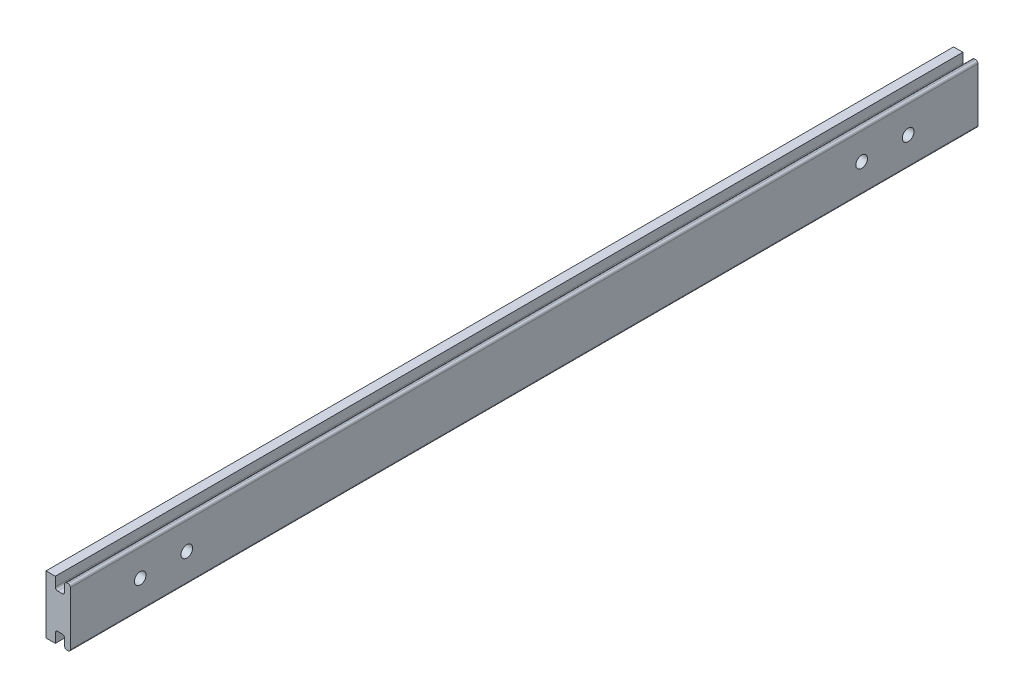
ISO-10303-21;
HEADER;
FILE_DESCRIPTION(('STEP AP214'),'2;1');
FILE_NAME('part.step','',(''),(''),'','','');
FILE_SCHEMA(('AUTOMOTIVE_DESIGN { 1 0 10303 214 1 1 1 1 }'));
ENDSEC;
DATA;
#1=APPLICATION_CONTEXT('core data for automotive mechanical design processes');
#2=APPLICATION_PROTOCOL_DEFINITION('international standard','automotive_design',2000,#1);
#3=PRODUCT_CONTEXT('',#1,'mechanical');
#4=PRODUCT('Part','Part','',(#3));
#5=PRODUCT_RELATED_PRODUCT_CATEGORY('part','',(#4));
#6=PRODUCT_DEFINITION_FORMATION('','',#4);
#7=PRODUCT_DEFINITION_CONTEXT('part definition',#1,'design');
#8=PRODUCT_DEFINITION('design','',#6,#7);
#9=PRODUCT_DEFINITION_SHAPE('','',#8);
#10=(LENGTH_UNIT() NAMED_UNIT(*) SI_UNIT(.MILLI.,.METRE.));
#11=(NAMED_UNIT(*) PLANE_ANGLE_UNIT() SI_UNIT($,.RADIAN.));
#12=(NAMED_UNIT(*) SI_UNIT($,.STERADIAN.) SOLID_ANGLE_UNIT());
#13=UNCERTAINTY_MEASURE_WITH_UNIT(LENGTH_MEASURE(1.E-05),#10,'distance_accuracy_value','');
#14=(GEOMETRIC_REPRESENTATION_CONTEXT(3) GLOBAL_UNCERTAINTY_ASSIGNED_CONTEXT((#13)) GLOBAL_UNIT_ASSIGNED_CONTEXT((#10,
#11,#12)) REPRESENTATION_CONTEXT('',''));
#15=CARTESIAN_POINT('',(0.,0.,0.));
#16=DIRECTION('',(0.,0.,1.));
#17=DIRECTION('',(1.,0.,0.));
#18=AXIS2_PLACEMENT_3D('',#15,#16,#17);
#19=CARTESIAN_POINT('',(1.,-8.5,195.));
#20=DIRECTION('',(0.,0.,-1.));
#21=DIRECTION('',(-1.,0.,0.));
#22=AXIS2_PLACEMENT_3D('',#19,#20,#21);
#23=CYLINDRICAL_SURFACE('',#22,0.999999999999999);
#24=CARTESIAN_POINT('',(1.,-8.5,-195.));
#25=DIRECTION('',(0.,0.,-1.));
#26=DIRECTION('',(-1.,0.,0.));
#27=AXIS2_PLACEMENT_3D('',#24,#25,#26);
#28=CIRCLE('',#27,0.999999999999999);
#29=CARTESIAN_POINT('',(1.,-7.5,-195.));
#30=VERTEX_POINT('',#29);
#31=CARTESIAN_POINT('',(2.,-8.5,-195.));
#32=VERTEX_POINT('',#31);
#33=EDGE_CURVE('E197',#30,#32,#28,.T.);
#34=ORIENTED_EDGE('',*,*,#33,.T.);
#35=DIRECTION('',(0.,0.,-1.));
#36=VECTOR('',#35,1.);
#37=CARTESIAN_POINT('',(2.,-8.5,195.));
#38=LINE('',#37,#36);
#39=CARTESIAN_POINT('',(2.,-8.5,195.));
#40=VERTEX_POINT('',#39);
#41=EDGE_CURVE('E179',#40,#32,#38,.T.);
#42=ORIENTED_EDGE('',*,*,#41,.F.);
#43=CARTESIAN_POINT('',(1.,-8.5,195.));
#44=DIRECTION('',(0.,0.,-1.));
#45=DIRECTION('',(-1.,0.,0.));
#46=AXIS2_PLACEMENT_3D('',#43,#44,#45);
#47=CIRCLE('',#46,0.999999999999999);
#48=CARTESIAN_POINT('',(1.,-7.5,195.));
#49=VERTEX_POINT('',#48);
#50=EDGE_CURVE('E184',#49,#40,#47,.T.);
#51=ORIENTED_EDGE('',*,*,#50,.F.);
#52=DIRECTION('',(0.,0.,-1.));
#53=VECTOR('',#52,1.);
#54=CARTESIAN_POINT('',(1.,-7.5,195.));
#55=LINE('',#54,#53);
#56=EDGE_CURVE('E274',#49,#30,#55,.T.);
#57=ORIENTED_EDGE('',*,*,#56,.T.);
#58=EDGE_LOOP('',(#34,#42,#51,#57));
#59=FACE_BOUND('',#58,.T.);
#60=ADVANCED_FACE('F34',(#59),#23,.F.);
#61=CARTESIAN_POINT('',(2.,-8.5,195.));
#62=DIRECTION('',(1.,0.,0.));
#63=DIRECTION('',(0.,1.,0.));
#64=AXIS2_PLACEMENT_3D('',#61,#62,#63);
#65=PLANE('',#64);
#66=DIRECTION('',(0.,-1.,0.));
#67=VECTOR('',#66,1.);
#68=CARTESIAN_POINT('',(2.,-8.5,-195.));
#69=LINE('',#68,#67);
#70=CARTESIAN_POINT('',(2.,-11.5,-195.));
#71=VERTEX_POINT('',#70);
#72=EDGE_CURVE('E243',#32,#71,#69,.T.);
#73=ORIENTED_EDGE('',*,*,#72,.T.);
#74=DIRECTION('',(0.,0.,-1.));
#75=VECTOR('',#74,1.);
#76=CARTESIAN_POINT('',(2.,-11.5,195.));
#77=LINE('',#76,#75);
#78=CARTESIAN_POINT('',(2.,-11.5,195.));
#79=VERTEX_POINT('',#78);
#80=EDGE_CURVE('E42',#71,#79,#77,.F.);
#81=ORIENTED_EDGE('',*,*,#80,.T.);
#82=DIRECTION('',(0.,-1.,0.));
#83=VECTOR('',#82,1.);
#84=CARTESIAN_POINT('',(2.,-8.5,195.));
#85=LINE('',#84,#83);
#86=EDGE_CURVE('E174',#40,#79,#85,.T.);
#87=ORIENTED_EDGE('',*,*,#86,.F.);
#88=ORIENTED_EDGE('',*,*,#41,.T.);
#89=EDGE_LOOP('',(#73,#81,#87,#88));
#90=FACE_BOUND('',#89,.T.);
#91=ADVANCED_FACE('F177',(#90),#65,.F.);
#92=CARTESIAN_POINT('',(2.,-12.5,195.));
#93=DIRECTION('',(0.,1.,0.));
#94=DIRECTION('',(0.,0.,1.));
#95=AXIS2_PLACEMENT_3D('',#92,#93,#94);
#96=PLANE('',#95);
#97=DIRECTION('',(1.,0.,0.));
#98=VECTOR('',#97,1.);
#99=CARTESIAN_POINT('',(2.,-12.5,-195.));
#100=LINE('',#99,#98);
#101=CARTESIAN_POINT('',(3.,-12.5,-195.));
#102=VERTEX_POINT('',#101);
#103=CARTESIAN_POINT('',(3.5,-12.5,-195.));
#104=VERTEX_POINT('',#103);
#105=EDGE_CURVE('E236',#102,#104,#100,.T.);
#106=ORIENTED_EDGE('',*,*,#105,.T.);
#107=DIRECTION('',(0.,0.,-1.));
#108=VECTOR('',#107,1.);
#109=CARTESIAN_POINT('',(3.5,-12.5,195.));
#110=LINE('',#109,#108);
#111=CARTESIAN_POINT('',(3.5,-12.5,195.));
#112=VERTEX_POINT('',#111);
#113=EDGE_CURVE('E57',#104,#112,#110,.F.);
#114=ORIENTED_EDGE('',*,*,#113,.T.);
#115=DIRECTION('',(1.,0.,0.));
#116=VECTOR('',#115,1.);
#117=CARTESIAN_POINT('',(2.,-12.5,195.));
#118=LINE('',#117,#116);
#119=CARTESIAN_POINT('',(3.,-12.5,195.));
#120=VERTEX_POINT('',#119);
#121=EDGE_CURVE('E183',#120,#112,#118,.T.);
#122=ORIENTED_EDGE('',*,*,#121,.F.);
#123=DIRECTION('',(0.,0.,-1.));
#124=VECTOR('',#123,1.);
#125=CARTESIAN_POINT('',(3.,-12.5,195.));
#126=LINE('',#125,#124);
#127=EDGE_CURVE('E230',#120,#102,#126,.T.);
#128=ORIENTED_EDGE('',*,*,#127,.T.);
#129=EDGE_LOOP('',(#106,#114,#122,#128));
#130=FACE_BOUND('',#129,.T.);
#131=ADVANCED_FACE('F235',(#130),#96,.F.);
#132=CARTESIAN_POINT('',(4.5,-12.5,195.));
#133=DIRECTION('',(-1.,0.,0.));
#134=DIRECTION('',(0.,0.,1.));
#135=AXIS2_PLACEMENT_3D('',#132,#133,#134);
#136=PLANE('',#135);
#137=CARTESIAN_POINT('',(4.5,0.,-145.));
#138=DIRECTION('',(-1.,0.,0.));
#139=DIRECTION('',(0.,0.,1.));
#140=AXIS2_PLACEMENT_3D('',#137,#138,#139);
#141=CIRCLE('',#140,2.5);
#142=CARTESIAN_POINT('',(4.5,0.,-142.5));
#143=VERTEX_POINT('',#142);
#144=EDGE_CURVE('E346',#143,#143,#141,.F.);
#145=ORIENTED_EDGE('',*,*,#144,.F.);
#146=EDGE_LOOP('',(#145));
#147=FACE_BOUND('',#146,.T.);
#148=CARTESIAN_POINT('',(4.5,0.,165.));
#149=DIRECTION('',(-1.,0.,0.));
#150=DIRECTION('',(0.,0.,1.));
#151=AXIS2_PLACEMENT_3D('',#148,#149,#150);
#152=CIRCLE('',#151,2.5);
#153=CARTESIAN_POINT('',(4.5,0.,167.5));
#154=VERTEX_POINT('',#153);
#155=EDGE_CURVE('E470',#154,#154,#152,.F.);
#156=ORIENTED_EDGE('',*,*,#155,.F.);
#157=EDGE_LOOP('',(#156));
#158=FACE_BOUND('',#157,.T.);
#159=CARTESIAN_POINT('',(4.5,0.,145.));
#160=DIRECTION('',(-1.,0.,0.));
#161=DIRECTION('',(0.,0.,1.));
#162=AXIS2_PLACEMENT_3D('',#159,#160,#161);
#163=CIRCLE('',#162,2.5);
#164=CARTESIAN_POINT('',(4.5,0.,147.5));
#165=VERTEX_POINT('',#164);
#166=EDGE_CURVE('E476',#165,#165,#163,.F.);
#167=ORIENTED_EDGE('',*,*,#166,.F.);
#168=EDGE_LOOP('',(#167));
#169=FACE_BOUND('',#168,.T.);
#170=CARTESIAN_POINT('',(4.5,0.,-165.));
#171=DIRECTION('',(-1.,0.,0.));
#172=DIRECTION('',(0.,0.,1.));
#173=AXIS2_PLACEMENT_3D('',#170,#171,#172);
#174=CIRCLE('',#173,2.5);
#175=CARTESIAN_POINT('',(4.5,0.,-162.5));
#176=VERTEX_POINT('',#175);
#177=EDGE_CURVE('E339',#176,#176,#174,.F.);
#178=ORIENTED_EDGE('',*,*,#177,.F.);
#179=EDGE_LOOP('',(#178));
#180=FACE_BOUND('',#179,.T.);
#181=DIRECTION('',(0.,1.,0.));
#182=VECTOR('',#181,1.);
#183=CARTESIAN_POINT('',(4.5,-12.5,-195.));
#184=LINE('',#183,#182);
#185=CARTESIAN_POINT('',(4.5,-11.5,-195.));
#186=VERTEX_POINT('',#185);
#187=CARTESIAN_POINT('',(4.5,11.5,-195.));
#188=VERTEX_POINT('',#187);
#189=EDGE_CURVE('E242',#186,#188,#184,.T.);
#190=ORIENTED_EDGE('',*,*,#189,.T.);
#191=DIRECTION('',(0.,0.,-1.));
#192=VECTOR('',#191,1.);
#193=CARTESIAN_POINT('',(4.5,11.5,195.));
#194=LINE('',#193,#192);
#195=CARTESIAN_POINT('',(4.5,11.5,195.));
#196=VERTEX_POINT('',#195);
#197=EDGE_CURVE('E221',#188,#196,#194,.F.);
#198=ORIENTED_EDGE('',*,*,#197,.T.);
#199=DIRECTION('',(0.,1.,0.));
#200=VECTOR('',#199,1.);
#201=CARTESIAN_POINT('',(4.5,-12.5,195.));
#202=LINE('',#201,#200);
#203=CARTESIAN_POINT('',(4.5,-11.5,195.));
#204=VERTEX_POINT('',#203);
#205=EDGE_CURVE('E351',#204,#196,#202,.T.);
#206=ORIENTED_EDGE('',*,*,#205,.F.);
#207=DIRECTION('',(0.,0.,-1.));
#208=VECTOR('',#207,1.);
#209=CARTESIAN_POINT('',(4.5,-11.5,195.));
#210=LINE('',#209,#208);
#211=EDGE_CURVE('E218',#204,#186,#210,.T.);
#212=ORIENTED_EDGE('',*,*,#211,.T.);
#213=EDGE_LOOP('',(#190,#198,#206,#212));
#214=FACE_BOUND('',#213,.T.);
#215=ADVANCED_FACE('F397',(#147,#158,#169,#180,#214),#136,.F.);
#216=CARTESIAN_POINT('',(2.,12.5,195.));
#217=DIRECTION('',(0.,-1.,0.));
#218=DIRECTION('',(0.,0.,-1.));
#219=AXIS2_PLACEMENT_3D('',#216,#217,#218);
#220=PLANE('',#219);
#221=DIRECTION('',(-1.,0.,0.));
#222=VECTOR('',#221,1.);
#223=CARTESIAN_POINT('',(2.,12.5,195.));
#224=LINE('',#223,#222);
#225=CARTESIAN_POINT('',(3.5,12.5,195.));
#226=VERTEX_POINT('',#225);
#227=CARTESIAN_POINT('',(3.,12.5,195.));
#228=VERTEX_POINT('',#227);
#229=EDGE_CURVE('E353',#226,#228,#224,.T.);
#230=ORIENTED_EDGE('',*,*,#229,.F.);
#231=DIRECTION('',(0.,0.,-1.));
#232=VECTOR('',#231,1.);
#233=CARTESIAN_POINT('',(3.5,12.5,195.));
#234=LINE('',#233,#232);
#235=CARTESIAN_POINT('',(3.5,12.5,-195.));
#236=VERTEX_POINT('',#235);
#237=EDGE_CURVE('E201',#226,#236,#234,.T.);
#238=ORIENTED_EDGE('',*,*,#237,.T.);
#239=DIRECTION('',(-1.,0.,0.));
#240=VECTOR('',#239,1.);
#241=CARTESIAN_POINT('',(2.,12.5,-195.));
#242=LINE('',#241,#240);
#243=CARTESIAN_POINT('',(3.,12.5,-195.));
#244=VERTEX_POINT('',#243);
#245=EDGE_CURVE('E246',#236,#244,#242,.T.);
#246=ORIENTED_EDGE('',*,*,#245,.T.);
#247=DIRECTION('',(0.,0.,-1.));
#248=VECTOR('',#247,1.);
#249=CARTESIAN_POINT('',(3.,12.5,195.));
#250=LINE('',#249,#248);
#251=EDGE_CURVE('E198',#244,#228,#250,.F.);
#252=ORIENTED_EDGE('',*,*,#251,.T.);
#253=EDGE_LOOP('',(#230,#238,#246,#252));
#254=FACE_BOUND('',#253,.T.);
#255=ADVANCED_FACE('F367',(#254),#220,.F.);
#256=CARTESIAN_POINT('',(2.,8.5,195.));
#257=DIRECTION('',(1.,0.,0.));
#258=DIRECTION('',(0.,1.,0.));
#259=AXIS2_PLACEMENT_3D('',#256,#257,#258);
#260=PLANE('',#259);
#261=DIRECTION('',(0.,-1.,0.));
#262=VECTOR('',#261,1.);
#263=CARTESIAN_POINT('',(2.,8.5,195.));
#264=LINE('',#263,#262);
#265=CARTESIAN_POINT('',(2.,11.5,195.));
#266=VERTEX_POINT('',#265);
#267=CARTESIAN_POINT('',(2.,8.5,195.));
#268=VERTEX_POINT('',#267);
#269=EDGE_CURVE('E355',#266,#268,#264,.T.);
#270=ORIENTED_EDGE('',*,*,#269,.F.);
#271=DIRECTION('',(0.,0.,-1.));
#272=VECTOR('',#271,1.);
#273=CARTESIAN_POINT('',(2.,11.5,195.));
#274=LINE('',#273,#272);
#275=CARTESIAN_POINT('',(2.,11.5,-195.));
#276=VERTEX_POINT('',#275);
#277=EDGE_CURVE('E11',#266,#276,#274,.T.);
#278=ORIENTED_EDGE('',*,*,#277,.T.);
#279=DIRECTION('',(0.,-1.,0.));
#280=VECTOR('',#279,1.);
#281=CARTESIAN_POINT('',(2.,8.5,-195.));
#282=LINE('',#281,#280);
#283=CARTESIAN_POINT('',(2.,8.5,-195.));
#284=VERTEX_POINT('',#283);
#285=EDGE_CURVE('E253',#276,#284,#282,.T.);
#286=ORIENTED_EDGE('',*,*,#285,.T.);
#287=DIRECTION('',(0.,0.,-1.));
#288=VECTOR('',#287,1.);
#289=CARTESIAN_POINT('',(2.,8.5,195.));
#290=LINE('',#289,#288);
#291=EDGE_CURVE('E199',#268,#284,#290,.T.);
#292=ORIENTED_EDGE('',*,*,#291,.F.);
#293=EDGE_LOOP('',(#270,#278,#286,#292));
#294=FACE_BOUND('',#293,.T.);
#295=ADVANCED_FACE('F361',(#294),#260,.F.);
#296=CARTESIAN_POINT('',(1.,8.5,195.));
#297=DIRECTION('',(0.,0.,-1.));
#298=DIRECTION('',(-1.,0.,0.));
#299=AXIS2_PLACEMENT_3D('',#296,#297,#298);
#300=CYLINDRICAL_SURFACE('',#299,0.999999999999999);
#301=CARTESIAN_POINT('',(1.,8.5,-195.));
#302=DIRECTION('',(0.,0.,-1.));
#303=DIRECTION('',(-1.,0.,0.));
#304=AXIS2_PLACEMENT_3D('',#301,#302,#303);
#305=CIRCLE('',#304,0.999999999999999);
#306=CARTESIAN_POINT('',(1.,7.5,-195.));
#307=VERTEX_POINT('',#306);
#308=EDGE_CURVE('E255',#284,#307,#305,.T.);
#309=ORIENTED_EDGE('',*,*,#308,.T.);
#310=DIRECTION('',(0.,0.,-1.));
#311=VECTOR('',#310,1.);
#312=CARTESIAN_POINT('',(1.,7.5,195.));
#313=LINE('',#312,#311);
#314=CARTESIAN_POINT('',(1.,7.5,195.));
#315=VERTEX_POINT('',#314);
#316=EDGE_CURVE('E204',#315,#307,#313,.T.);
#317=ORIENTED_EDGE('',*,*,#316,.F.);
#318=CARTESIAN_POINT('',(1.,8.5,195.));
#319=DIRECTION('',(0.,0.,-1.));
#320=DIRECTION('',(-1.,0.,0.));
#321=AXIS2_PLACEMENT_3D('',#318,#319,#320);
#322=CIRCLE('',#321,0.999999999999999);
#323=EDGE_CURVE('E357',#268,#315,#322,.T.);
#324=ORIENTED_EDGE('',*,*,#323,.F.);
#325=ORIENTED_EDGE('',*,*,#291,.T.);
#326=EDGE_LOOP('',(#309,#317,#324,#325));
#327=FACE_BOUND('',#326,.T.);
#328=ADVANCED_FACE('F359',(#327),#300,.F.);
#329=CARTESIAN_POINT('',(-1.,7.5,195.));
#330=DIRECTION('',(0.,-1.,0.));
#331=DIRECTION('',(0.,0.,-1.));
#332=AXIS2_PLACEMENT_3D('',#329,#330,#331);
#333=PLANE('',#332);
#334=DIRECTION('',(-1.,0.,0.));
#335=VECTOR('',#334,1.);
#336=CARTESIAN_POINT('',(-1.,7.5,-195.));
#337=LINE('',#336,#335);
#338=CARTESIAN_POINT('',(-1.,7.5,-195.));
#339=VERTEX_POINT('',#338);
#340=EDGE_CURVE('E257',#307,#339,#337,.T.);
#341=ORIENTED_EDGE('',*,*,#340,.T.);
#342=DIRECTION('',(0.,0.,-1.));
#343=VECTOR('',#342,1.);
#344=CARTESIAN_POINT('',(-1.,7.5,195.));
#345=LINE('',#344,#343);
#346=CARTESIAN_POINT('',(-1.,7.5,195.));
#347=VERTEX_POINT('',#346);
#348=EDGE_CURVE('E297',#347,#339,#345,.T.);
#349=ORIENTED_EDGE('',*,*,#348,.F.);
#350=DIRECTION('',(-1.,0.,0.));
#351=VECTOR('',#350,1.);
#352=CARTESIAN_POINT('',(-1.,7.5,195.));
#353=LINE('',#352,#351);
#354=EDGE_CURVE('E306',#315,#347,#353,.T.);
#355=ORIENTED_EDGE('',*,*,#354,.F.);
#356=ORIENTED_EDGE('',*,*,#316,.T.);
#357=EDGE_LOOP('',(#341,#349,#355,#356));
#358=FACE_BOUND('',#357,.T.);
#359=ADVANCED_FACE('F304',(#358),#333,.F.);
#360=CARTESIAN_POINT('',(-1.,8.5,195.));
#361=DIRECTION('',(0.,0.,-1.));
#362=DIRECTION('',(-1.,0.,0.));
#363=AXIS2_PLACEMENT_3D('',#360,#361,#362);
#364=CYLINDRICAL_SURFACE('',#363,0.999999999999999);
#365=CARTESIAN_POINT('',(-1.,8.5,-195.));
#366=DIRECTION('',(0.,0.,-1.));
#367=DIRECTION('',(-1.,0.,0.));
#368=AXIS2_PLACEMENT_3D('',#365,#366,#367);
#369=CIRCLE('',#368,0.999999999999999);
#370=CARTESIAN_POINT('',(-2.,8.5,-195.));
#371=VERTEX_POINT('',#370);
#372=EDGE_CURVE('E259',#339,#371,#369,.T.);
#373=ORIENTED_EDGE('',*,*,#372,.T.);
#374=DIRECTION('',(0.,0.,-1.));
#375=VECTOR('',#374,1.);
#376=CARTESIAN_POINT('',(-2.,8.5,195.));
#377=LINE('',#376,#375);
#378=CARTESIAN_POINT('',(-2.,8.5,195.));
#379=VERTEX_POINT('',#378);
#380=EDGE_CURVE('E294',#379,#371,#377,.T.);
#381=ORIENTED_EDGE('',*,*,#380,.F.);
#382=CARTESIAN_POINT('',(-1.,8.5,195.));
#383=DIRECTION('',(0.,0.,-1.));
#384=DIRECTION('',(-1.,0.,0.));
#385=AXIS2_PLACEMENT_3D('',#382,#383,#384);
#386=CIRCLE('',#385,0.999999999999999);
#387=EDGE_CURVE('E325',#347,#379,#386,.T.);
#388=ORIENTED_EDGE('',*,*,#387,.F.);
#389=ORIENTED_EDGE('',*,*,#348,.T.);
#390=EDGE_LOOP('',(#373,#381,#388,#389));
#391=FACE_BOUND('',#390,.T.);
#392=ADVANCED_FACE('F316',(#391),#364,.F.);
#393=CARTESIAN_POINT('',(-2.,12.5,195.));
#394=DIRECTION('',(-1.,0.,0.));
#395=DIRECTION('',(0.,-1.,0.));
#396=AXIS2_PLACEMENT_3D('',#393,#394,#395);
#397=PLANE('',#396);
#398=DIRECTION('',(0.,1.,0.));
#399=VECTOR('',#398,1.);
#400=CARTESIAN_POINT('',(-2.,12.5,-195.));
#401=LINE('',#400,#399);
#402=CARTESIAN_POINT('',(-2.,12.5,-195.));
#403=VERTEX_POINT('',#402);
#404=EDGE_CURVE('E261',#371,#403,#401,.T.);
#405=ORIENTED_EDGE('',*,*,#404,.T.);
#406=DIRECTION('',(0.,0.,-1.));
#407=VECTOR('',#406,1.);
#408=CARTESIAN_POINT('',(-2.,12.5,195.));
#409=LINE('',#408,#407);
#410=CARTESIAN_POINT('',(-2.,12.5,195.));
#411=VERTEX_POINT('',#410);
#412=EDGE_CURVE('E291',#411,#403,#409,.T.);
#413=ORIENTED_EDGE('',*,*,#412,.F.);
#414=DIRECTION('',(0.,1.,0.));
#415=VECTOR('',#414,1.);
#416=CARTESIAN_POINT('',(-2.,12.5,195.));
#417=LINE('',#416,#415);
#418=EDGE_CURVE('E322',#379,#411,#417,.T.);
#419=ORIENTED_EDGE('',*,*,#418,.F.);
#420=ORIENTED_EDGE('',*,*,#380,.T.);
#421=EDGE_LOOP('',(#405,#413,#419,#420));
#422=FACE_BOUND('',#421,.T.);
#423=ADVANCED_FACE('F320',(#422),#397,.F.);
#424=CARTESIAN_POINT('',(-6.,12.5,195.));
#425=DIRECTION('',(0.,-1.,0.));
#426=DIRECTION('',(0.,0.,-1.));
#427=AXIS2_PLACEMENT_3D('',#424,#425,#426);
#428=PLANE('',#427);
#429=DIRECTION('',(-1.,0.,0.));
#430=VECTOR('',#429,1.);
#431=CARTESIAN_POINT('',(-6.,12.5,-195.));
#432=LINE('',#431,#430);
#433=CARTESIAN_POINT('',(-6.,12.5,-195.));
#434=VERTEX_POINT('',#433);
#435=EDGE_CURVE('E263',#403,#434,#432,.T.);
#436=ORIENTED_EDGE('',*,*,#435,.T.);
#437=DIRECTION('',(0.,0.,-1.));
#438=VECTOR('',#437,1.);
#439=CARTESIAN_POINT('',(-6.,12.5,195.));
#440=LINE('',#439,#438);
#441=CARTESIAN_POINT('',(-6.,12.5,195.));
#442=VERTEX_POINT('',#441);
#443=EDGE_CURVE('E288',#442,#434,#440,.T.);
#444=ORIENTED_EDGE('',*,*,#443,.F.);
#445=DIRECTION('',(-1.,0.,0.));
#446=VECTOR('',#445,1.);
#447=CARTESIAN_POINT('',(-6.,12.5,195.));
#448=LINE('',#447,#446);
#449=EDGE_CURVE('E324',#411,#442,#448,.T.);
#450=ORIENTED_EDGE('',*,*,#449,.F.);
#451=ORIENTED_EDGE('',*,*,#412,.T.);
#452=EDGE_LOOP('',(#436,#444,#450,#451));
#453=FACE_BOUND('',#452,.T.);
#454=ADVANCED_FACE('F420',(#453),#428,.F.);
#455=CARTESIAN_POINT('',(-6.,12.5,195.));
#456=DIRECTION('',(1.,0.,0.));
#457=DIRECTION('',(0.,0.,-1.));
#458=AXIS2_PLACEMENT_3D('',#455,#456,#457);
#459=PLANE('',#458);
#460=CARTESIAN_POINT('',(-6.,0.,-145.));
#461=DIRECTION('',(-1.,0.,0.));
#462=DIRECTION('',(0.,0.,1.));
#463=AXIS2_PLACEMENT_3D('',#460,#461,#462);
#464=CIRCLE('',#463,2.5);
#465=CARTESIAN_POINT('',(-6.,0.,-142.5));
#466=VERTEX_POINT('',#465);
#467=EDGE_CURVE('E467',#466,#466,#464,.T.);
#468=ORIENTED_EDGE('',*,*,#467,.F.);
#469=EDGE_LOOP('',(#468));
#470=FACE_BOUND('',#469,.T.);
#471=CARTESIAN_POINT('',(-6.,0.,165.));
#472=DIRECTION('',(-1.,0.,0.));
#473=DIRECTION('',(0.,0.,-1.));
#474=AXIS2_PLACEMENT_3D('',#471,#472,#473);
#475=CIRCLE('',#474,2.5);
#476=CARTESIAN_POINT('',(-6.,0.,162.5));
#477=VERTEX_POINT('',#476);
#478=EDGE_CURVE('E473',#477,#477,#475,.T.);
#479=ORIENTED_EDGE('',*,*,#478,.F.);
#480=EDGE_LOOP('',(#479));
#481=FACE_BOUND('',#480,.T.);
#482=CARTESIAN_POINT('',(-6.,0.,145.));
#483=DIRECTION('',(-1.,0.,0.));
#484=DIRECTION('',(0.,0.,-1.));
#485=AXIS2_PLACEMENT_3D('',#482,#483,#484);
#486=CIRCLE('',#485,2.5);
#487=CARTESIAN_POINT('',(-6.,0.,142.5));
#488=VERTEX_POINT('',#487);
#489=EDGE_CURVE('E479',#488,#488,#486,.T.);
#490=ORIENTED_EDGE('',*,*,#489,.F.);
#491=EDGE_LOOP('',(#490));
#492=FACE_BOUND('',#491,.T.);
#493=CARTESIAN_POINT('',(-6.,0.,-165.));
#494=DIRECTION('',(-1.,0.,0.));
#495=DIRECTION('',(0.,0.,1.));
#496=AXIS2_PLACEMENT_3D('',#493,#494,#495);
#497=CIRCLE('',#496,2.5);
#498=CARTESIAN_POINT('',(-6.,0.,-162.5));
#499=VERTEX_POINT('',#498);
#500=EDGE_CURVE('E341',#499,#499,#497,.T.);
#501=ORIENTED_EDGE('',*,*,#500,.F.);
#502=EDGE_LOOP('',(#501));
#503=FACE_BOUND('',#502,.T.);
#504=DIRECTION('',(0.,-1.,0.));
#505=VECTOR('',#504,1.);
#506=CARTESIAN_POINT('',(-6.,12.5,-195.));
#507=LINE('',#506,#505);
#508=CARTESIAN_POINT('',(-6.,-12.5,-195.));
#509=VERTEX_POINT('',#508);
#510=EDGE_CURVE('E265',#434,#509,#507,.T.);
#511=ORIENTED_EDGE('',*,*,#510,.T.);
#512=DIRECTION('',(0.,0.,-1.));
#513=VECTOR('',#512,1.);
#514=CARTESIAN_POINT('',(-6.,-12.5,195.));
#515=LINE('',#514,#513);
#516=CARTESIAN_POINT('',(-6.,-12.5,195.));
#517=VERTEX_POINT('',#516);
#518=EDGE_CURVE('E285',#517,#509,#515,.T.);
#519=ORIENTED_EDGE('',*,*,#518,.F.);
#520=DIRECTION('',(0.,-1.,0.));
#521=VECTOR('',#520,1.);
#522=CARTESIAN_POINT('',(-6.,12.5,195.));
#523=LINE('',#522,#521);
#524=EDGE_CURVE('E327',#442,#517,#523,.T.);
#525=ORIENTED_EDGE('',*,*,#524,.F.);
#526=ORIENTED_EDGE('',*,*,#443,.T.);
#527=EDGE_LOOP('',(#511,#519,#525,#526));
#528=FACE_BOUND('',#527,.T.);
#529=ADVANCED_FACE('F423',(#470,#481,#492,#503,#528),#459,.F.);
#530=CARTESIAN_POINT('',(-6.,-12.5,195.));
#531=DIRECTION('',(0.,1.,0.));
#532=DIRECTION('',(0.,0.,1.));
#533=AXIS2_PLACEMENT_3D('',#530,#531,#532);
#534=PLANE('',#533);
#535=DIRECTION('',(1.,0.,0.));
#536=VECTOR('',#535,1.);
#537=CARTESIAN_POINT('',(-6.,-12.5,-195.));
#538=LINE('',#537,#536);
#539=CARTESIAN_POINT('',(-2.,-12.5,-195.));
#540=VERTEX_POINT('',#539);
#541=EDGE_CURVE('E267',#509,#540,#538,.T.);
#542=ORIENTED_EDGE('',*,*,#541,.T.);
#543=DIRECTION('',(0.,0.,-1.));
#544=VECTOR('',#543,1.);
#545=CARTESIAN_POINT('',(-2.,-12.5,195.));
#546=LINE('',#545,#544);
#547=CARTESIAN_POINT('',(-2.,-12.5,195.));
#548=VERTEX_POINT('',#547);
#549=EDGE_CURVE('E282',#548,#540,#546,.T.);
#550=ORIENTED_EDGE('',*,*,#549,.F.);
#551=DIRECTION('',(1.,0.,0.));
#552=VECTOR('',#551,1.);
#553=CARTESIAN_POINT('',(-6.,-12.5,195.));
#554=LINE('',#553,#552);
#555=EDGE_CURVE('E333',#517,#548,#554,.T.);
#556=ORIENTED_EDGE('',*,*,#555,.F.);
#557=ORIENTED_EDGE('',*,*,#518,.T.);
#558=EDGE_LOOP('',(#542,#550,#556,#557));
#559=FACE_BOUND('',#558,.T.);
#560=ADVANCED_FACE('F427',(#559),#534,.F.);
#561=CARTESIAN_POINT('',(-2.,-12.5,195.));
#562=DIRECTION('',(-1.,0.,0.));
#563=DIRECTION('',(0.,-1.,0.));
#564=AXIS2_PLACEMENT_3D('',#561,#562,#563);
#565=PLANE('',#564);
#566=DIRECTION('',(0.,1.,0.));
#567=VECTOR('',#566,1.);
#568=CARTESIAN_POINT('',(-2.,-12.5,-195.));
#569=LINE('',#568,#567);
#570=CARTESIAN_POINT('',(-2.,-8.5,-195.));
#571=VERTEX_POINT('',#570);
#572=EDGE_CURVE('E269',#540,#571,#569,.T.);
#573=ORIENTED_EDGE('',*,*,#572,.T.);
#574=DIRECTION('',(0.,0.,-1.));
#575=VECTOR('',#574,1.);
#576=CARTESIAN_POINT('',(-2.,-8.5,195.));
#577=LINE('',#576,#575);
#578=CARTESIAN_POINT('',(-2.,-8.5,195.));
#579=VERTEX_POINT('',#578);
#580=EDGE_CURVE('E279',#579,#571,#577,.T.);
#581=ORIENTED_EDGE('',*,*,#580,.F.);
#582=DIRECTION('',(0.,1.,0.));
#583=VECTOR('',#582,1.);
#584=CARTESIAN_POINT('',(-2.,-12.5,195.));
#585=LINE('',#584,#583);
#586=EDGE_CURVE('E335',#548,#579,#585,.T.);
#587=ORIENTED_EDGE('',*,*,#586,.F.);
#588=ORIENTED_EDGE('',*,*,#549,.T.);
#589=EDGE_LOOP('',(#573,#581,#587,#588));
#590=FACE_BOUND('',#589,.T.);
#591=ADVANCED_FACE('F431',(#590),#565,.F.);
#592=CARTESIAN_POINT('',(-1.,-8.5,195.));
#593=DIRECTION('',(0.,0.,-1.));
#594=DIRECTION('',(-1.,0.,0.));
#595=AXIS2_PLACEMENT_3D('',#592,#593,#594);
#596=CYLINDRICAL_SURFACE('',#595,0.999999999999999);
#597=CARTESIAN_POINT('',(-1.,-8.5,-195.));
#598=DIRECTION('',(0.,0.,-1.));
#599=DIRECTION('',(-1.,0.,0.));
#600=AXIS2_PLACEMENT_3D('',#597,#598,#599);
#601=CIRCLE('',#600,0.999999999999999);
#602=CARTESIAN_POINT('',(-1.,-7.5,-195.));
#603=VERTEX_POINT('',#602);
#604=EDGE_CURVE('E271',#571,#603,#601,.T.);
#605=ORIENTED_EDGE('',*,*,#604,.T.);
#606=DIRECTION('',(0.,0.,-1.));
#607=VECTOR('',#606,1.);
#608=CARTESIAN_POINT('',(-1.,-7.5,195.));
#609=LINE('',#608,#607);
#610=CARTESIAN_POINT('',(-1.,-7.5,195.));
#611=VERTEX_POINT('',#610);
#612=EDGE_CURVE('E276',#611,#603,#609,.T.);
#613=ORIENTED_EDGE('',*,*,#612,.F.);
#614=CARTESIAN_POINT('',(-1.,-8.5,195.));
#615=DIRECTION('',(0.,0.,-1.));
#616=DIRECTION('',(-1.,0.,0.));
#617=AXIS2_PLACEMENT_3D('',#614,#615,#616);
#618=CIRCLE('',#617,0.999999999999999);
#619=EDGE_CURVE('E337',#579,#611,#618,.T.);
#620=ORIENTED_EDGE('',*,*,#619,.F.);
#621=ORIENTED_EDGE('',*,*,#580,.T.);
#622=EDGE_LOOP('',(#605,#613,#620,#621));
#623=FACE_BOUND('',#622,.T.);
#624=ADVANCED_FACE('F435',(#623),#596,.F.);
#625=CARTESIAN_POINT('',(-1.,-7.5,195.));
#626=DIRECTION('',(0.,1.,0.));
#627=DIRECTION('',(0.,0.,1.));
#628=AXIS2_PLACEMENT_3D('',#625,#626,#627);
#629=PLANE('',#628);
#630=DIRECTION('',(1.,0.,0.));
#631=VECTOR('',#630,1.);
#632=CARTESIAN_POINT('',(-1.,-7.5,-195.));
#633=LINE('',#632,#631);
#634=EDGE_CURVE('E194',#603,#30,#633,.T.);
#635=ORIENTED_EDGE('',*,*,#634,.T.);
#636=ORIENTED_EDGE('',*,*,#56,.F.);
#637=DIRECTION('',(1.,0.,0.));
#638=VECTOR('',#637,1.);
#639=CARTESIAN_POINT('',(-1.,-7.5,195.));
#640=LINE('',#639,#638);
#641=EDGE_CURVE('E190',#611,#49,#640,.T.);
#642=ORIENTED_EDGE('',*,*,#641,.F.);
#643=ORIENTED_EDGE('',*,*,#612,.T.);
#644=EDGE_LOOP('',(#635,#636,#642,#643));
#645=FACE_BOUND('',#644,.T.);
#646=ADVANCED_FACE('F439',(#645),#629,.F.);
#647=CARTESIAN_POINT('',(1.,-8.5,195.));
#648=DIRECTION('',(0.,0.,-1.));
#649=DIRECTION('',(-1.,0.,0.));
#650=AXIS2_PLACEMENT_3D('',#647,#648,#649);
#651=PLANE('',#650);
#652=ORIENTED_EDGE('',*,*,#205,.T.);
#653=CARTESIAN_POINT('',(3.5,11.5,195.));
#654=DIRECTION('',(0.,0.,-1.));
#655=DIRECTION('',(-1.,0.,0.));
#656=AXIS2_PLACEMENT_3D('',#653,#654,#655);
#657=CIRCLE('',#656,1.);
#658=EDGE_CURVE('E228',#196,#226,#657,.F.);
#659=ORIENTED_EDGE('',*,*,#658,.T.);
#660=ORIENTED_EDGE('',*,*,#229,.T.);
#661=CARTESIAN_POINT('',(3.,11.5,195.));
#662=DIRECTION('',(0.,0.,-1.));
#663=DIRECTION('',(-1.,0.,0.));
#664=AXIS2_PLACEMENT_3D('',#661,#662,#663);
#665=CIRCLE('',#664,1.);
#666=EDGE_CURVE('E49',#228,#266,#665,.F.);
#667=ORIENTED_EDGE('',*,*,#666,.T.);
#668=ORIENTED_EDGE('',*,*,#269,.T.);
#669=ORIENTED_EDGE('',*,*,#323,.T.);
#670=ORIENTED_EDGE('',*,*,#354,.T.);
#671=ORIENTED_EDGE('',*,*,#387,.T.);
#672=ORIENTED_EDGE('',*,*,#418,.T.);
#673=ORIENTED_EDGE('',*,*,#449,.T.);
#674=ORIENTED_EDGE('',*,*,#524,.T.);
#675=ORIENTED_EDGE('',*,*,#555,.T.);
#676=ORIENTED_EDGE('',*,*,#586,.T.);
#677=ORIENTED_EDGE('',*,*,#619,.T.);
#678=ORIENTED_EDGE('',*,*,#641,.T.);
#679=ORIENTED_EDGE('',*,*,#50,.T.);
#680=ORIENTED_EDGE('',*,*,#86,.T.);
#681=CARTESIAN_POINT('',(3.,-11.5,195.));
#682=DIRECTION('',(0.,0.,-1.));
#683=DIRECTION('',(-1.,0.,0.));
#684=AXIS2_PLACEMENT_3D('',#681,#682,#683);
#685=CIRCLE('',#684,1.);
#686=EDGE_CURVE('E224',#79,#120,#685,.F.);
#687=ORIENTED_EDGE('',*,*,#686,.T.);
#688=ORIENTED_EDGE('',*,*,#121,.T.);
#689=CARTESIAN_POINT('',(3.5,-11.5,195.));
#690=DIRECTION('',(0.,0.,-1.));
#691=DIRECTION('',(-1.,0.,0.));
#692=AXIS2_PLACEMENT_3D('',#689,#690,#691);
#693=CIRCLE('',#692,1.);
#694=EDGE_CURVE('E226',#112,#204,#693,.F.);
#695=ORIENTED_EDGE('',*,*,#694,.T.);
#696=EDGE_LOOP('',(#652,#659,#660,#667,#668,#669,#670,#671,#672,#673,#674,#675,#676,#677,#678,
#679,#680,#687,#688,#695));
#697=FACE_BOUND('',#696,.T.);
#698=ADVANCED_FACE('F188',(#697),#651,.F.);
#699=CARTESIAN_POINT('',(1.,-8.5,-195.));
#700=DIRECTION('',(0.,0.,-1.));
#701=DIRECTION('',(-1.,0.,0.));
#702=AXIS2_PLACEMENT_3D('',#699,#700,#701);
#703=PLANE('',#702);
#704=ORIENTED_EDGE('',*,*,#245,.F.);
#705=CARTESIAN_POINT('',(3.5,11.5,-195.));
#706=DIRECTION('',(0.,0.,-1.));
#707=DIRECTION('',(-1.,0.,0.));
#708=AXIS2_PLACEMENT_3D('',#705,#706,#707);
#709=CIRCLE('',#708,1.);
#710=EDGE_CURVE('E216',#236,#188,#709,.T.);
#711=ORIENTED_EDGE('',*,*,#710,.T.);
#712=ORIENTED_EDGE('',*,*,#189,.F.);
#713=CARTESIAN_POINT('',(3.5,-11.5,-195.));
#714=DIRECTION('',(0.,0.,-1.));
#715=DIRECTION('',(-1.,0.,0.));
#716=AXIS2_PLACEMENT_3D('',#713,#714,#715);
#717=CIRCLE('',#716,1.);
#718=EDGE_CURVE('E214',#186,#104,#717,.T.);
#719=ORIENTED_EDGE('',*,*,#718,.T.);
#720=ORIENTED_EDGE('',*,*,#105,.F.);
#721=CARTESIAN_POINT('',(3.,-11.5,-195.));
#722=DIRECTION('',(0.,0.,-1.));
#723=DIRECTION('',(-1.,0.,0.));
#724=AXIS2_PLACEMENT_3D('',#721,#722,#723);
#725=CIRCLE('',#724,1.);
#726=EDGE_CURVE('E212',#102,#71,#725,.T.);
#727=ORIENTED_EDGE('',*,*,#726,.T.);
#728=ORIENTED_EDGE('',*,*,#72,.F.);
#729=ORIENTED_EDGE('',*,*,#33,.F.);
#730=ORIENTED_EDGE('',*,*,#634,.F.);
#731=ORIENTED_EDGE('',*,*,#604,.F.);
#732=ORIENTED_EDGE('',*,*,#572,.F.);
#733=ORIENTED_EDGE('',*,*,#541,.F.);
#734=ORIENTED_EDGE('',*,*,#510,.F.);
#735=ORIENTED_EDGE('',*,*,#435,.F.);
#736=ORIENTED_EDGE('',*,*,#404,.F.);
#737=ORIENTED_EDGE('',*,*,#372,.F.);
#738=ORIENTED_EDGE('',*,*,#340,.F.);
#739=ORIENTED_EDGE('',*,*,#308,.F.);
#740=ORIENTED_EDGE('',*,*,#285,.F.);
#741=CARTESIAN_POINT('',(3.,11.5,-195.));
#742=DIRECTION('',(0.,0.,-1.));
#743=DIRECTION('',(-1.,0.,0.));
#744=AXIS2_PLACEMENT_3D('',#741,#742,#743);
#745=CIRCLE('',#744,1.);
#746=EDGE_CURVE('E210',#276,#244,#745,.T.);
#747=ORIENTED_EDGE('',*,*,#746,.T.);
#748=EDGE_LOOP('',(#704,#711,#712,#719,#720,#727,#728,#729,#730,#731,#732,#733,#734,#735,#736,
#737,#738,#739,#740,#747));
#749=FACE_BOUND('',#748,.T.);
#750=ADVANCED_FACE('F240',(#749),#703,.T.);
#751=CARTESIAN_POINT('',(4.501,0.,-165.));
#752=DIRECTION('',(-1.,0.,0.));
#753=DIRECTION('',(0.,0.,1.));
#754=AXIS2_PLACEMENT_3D('',#751,#752,#753);
#755=CYLINDRICAL_SURFACE('',#754,2.5);
#756=ORIENTED_EDGE('',*,*,#500,.T.);
#757=EDGE_LOOP('',(#756));
#758=FACE_BOUND('',#757,.T.);
#759=ORIENTED_EDGE('',*,*,#177,.T.);
#760=EDGE_LOOP('',(#759));
#761=FACE_BOUND('',#760,.T.);
#762=ADVANCED_FACE('F446',(#758,#761),#755,.F.);
#763=CARTESIAN_POINT('',(4.501,0.,145.));
#764=DIRECTION('',(-1.,0.,0.));
#765=DIRECTION('',(0.,0.,1.));
#766=AXIS2_PLACEMENT_3D('',#763,#764,#765);
#767=CYLINDRICAL_SURFACE('',#766,2.5);
#768=ORIENTED_EDGE('',*,*,#489,.T.);
#769=EDGE_LOOP('',(#768));
#770=FACE_BOUND('',#769,.T.);
#771=ORIENTED_EDGE('',*,*,#166,.T.);
#772=EDGE_LOOP('',(#771));
#773=FACE_BOUND('',#772,.T.);
#774=ADVANCED_FACE('F451',(#770,#773),#767,.F.);
#775=CARTESIAN_POINT('',(4.501,0.,165.));
#776=DIRECTION('',(-1.,0.,0.));
#777=DIRECTION('',(0.,0.,1.));
#778=AXIS2_PLACEMENT_3D('',#775,#776,#777);
#779=CYLINDRICAL_SURFACE('',#778,2.5);
#780=ORIENTED_EDGE('',*,*,#478,.T.);
#781=EDGE_LOOP('',(#780));
#782=FACE_BOUND('',#781,.T.);
#783=ORIENTED_EDGE('',*,*,#155,.T.);
#784=EDGE_LOOP('',(#783));
#785=FACE_BOUND('',#784,.T.);
#786=ADVANCED_FACE('F455',(#782,#785),#779,.F.);
#787=CARTESIAN_POINT('',(4.501,0.,-145.));
#788=DIRECTION('',(-1.,0.,0.));
#789=DIRECTION('',(0.,0.,1.));
#790=AXIS2_PLACEMENT_3D('',#787,#788,#789);
#791=CYLINDRICAL_SURFACE('',#790,2.5);
#792=ORIENTED_EDGE('',*,*,#467,.T.);
#793=EDGE_LOOP('',(#792));
#794=FACE_BOUND('',#793,.T.);
#795=ORIENTED_EDGE('',*,*,#144,.T.);
#796=EDGE_LOOP('',(#795));
#797=FACE_BOUND('',#796,.T.);
#798=ADVANCED_FACE('F386',(#794,#797),#791,.F.);
#799=CARTESIAN_POINT('',(3.5,11.5,195.));
#800=DIRECTION('',(0.,0.,-1.));
#801=DIRECTION('',(-1.,0.,0.));
#802=AXIS2_PLACEMENT_3D('',#799,#800,#801);
#803=CYLINDRICAL_SURFACE('',#802,1.);
#804=ORIENTED_EDGE('',*,*,#658,.F.);
#805=ORIENTED_EDGE('',*,*,#197,.F.);
#806=ORIENTED_EDGE('',*,*,#710,.F.);
#807=ORIENTED_EDGE('',*,*,#237,.F.);
#808=EDGE_LOOP('',(#804,#805,#806,#807));
#809=FACE_BOUND('',#808,.T.);
#810=ADVANCED_FACE('F383',(#809),#803,.T.);
#811=CARTESIAN_POINT('',(3.5,-11.5,195.));
#812=DIRECTION('',(0.,0.,-1.));
#813=DIRECTION('',(-1.,0.,0.));
#814=AXIS2_PLACEMENT_3D('',#811,#812,#813);
#815=CYLINDRICAL_SURFACE('',#814,1.);
#816=ORIENTED_EDGE('',*,*,#694,.F.);
#817=ORIENTED_EDGE('',*,*,#113,.F.);
#818=ORIENTED_EDGE('',*,*,#718,.F.);
#819=ORIENTED_EDGE('',*,*,#211,.F.);
#820=EDGE_LOOP('',(#816,#817,#818,#819));
#821=FACE_BOUND('',#820,.T.);
#822=ADVANCED_FACE('F374',(#821),#815,.T.);
#823=CARTESIAN_POINT('',(3.,-11.5,195.));
#824=DIRECTION('',(0.,0.,-1.));
#825=DIRECTION('',(-1.,0.,0.));
#826=AXIS2_PLACEMENT_3D('',#823,#824,#825);
#827=CYLINDRICAL_SURFACE('',#826,1.);
#828=ORIENTED_EDGE('',*,*,#686,.F.);
#829=ORIENTED_EDGE('',*,*,#80,.F.);
#830=ORIENTED_EDGE('',*,*,#726,.F.);
#831=ORIENTED_EDGE('',*,*,#127,.F.);
#832=EDGE_LOOP('',(#828,#829,#830,#831));
#833=FACE_BOUND('',#832,.T.);
#834=ADVANCED_FACE('F370',(#833),#827,.T.);
#835=CARTESIAN_POINT('',(3.,11.5,195.));
#836=DIRECTION('',(0.,0.,-1.));
#837=DIRECTION('',(-1.,0.,0.));
#838=AXIS2_PLACEMENT_3D('',#835,#836,#837);
#839=CYLINDRICAL_SURFACE('',#838,1.);
#840=ORIENTED_EDGE('',*,*,#666,.F.);
#841=ORIENTED_EDGE('',*,*,#251,.F.);
#842=ORIENTED_EDGE('',*,*,#746,.F.);
#843=ORIENTED_EDGE('',*,*,#277,.F.);
#844=EDGE_LOOP('',(#840,#841,#842,#843));
#845=FACE_BOUND('',#844,.T.);
#846=ADVANCED_FACE('F36',(#845),#839,.T.);
#847=CLOSED_SHELL('',(#60,#91,#131,#215,#255,#295,#328,#359,#392,#423,#454,#529,#560,#591,#624,
#646,#698,#750,#762,#774,#786,#798,#810,#822,#834,#846));
#848=MANIFOLD_SOLID_BREP('B2',#847);
#849=ADVANCED_BREP_SHAPE_REPRESENTATION('',(#18,#848),#14);
#850=SHAPE_DEFINITION_REPRESENTATION(#9,#849);
ENDSEC;
END-ISO-10303-21;
